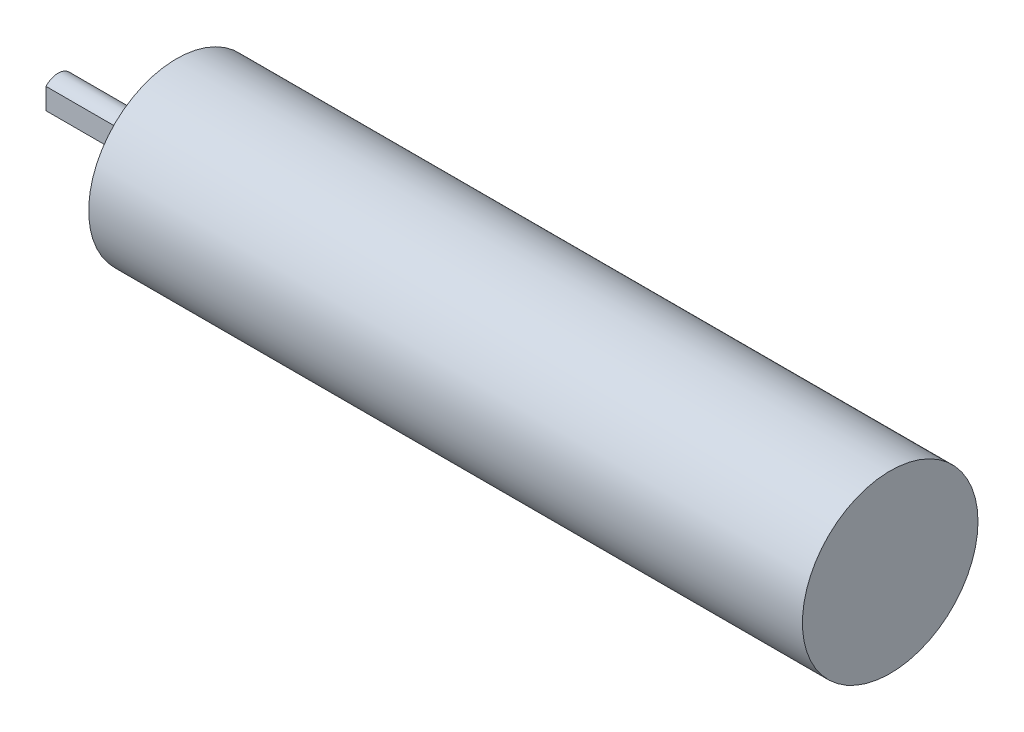
ISO-10303-21;
HEADER;
FILE_DESCRIPTION(('STEP AP214'),'2;1');
FILE_NAME('part.step','',(''),(''),'','','');
FILE_SCHEMA(('AUTOMOTIVE_DESIGN { 1 0 10303 214 1 1 1 1 }'));
ENDSEC;
DATA;
#1=APPLICATION_CONTEXT('core data for automotive mechanical design processes');
#2=APPLICATION_PROTOCOL_DEFINITION('international standard','automotive_design',2000,#1);
#3=PRODUCT_CONTEXT('',#1,'mechanical');
#4=PRODUCT('Part','Part','',(#3));
#5=PRODUCT_RELATED_PRODUCT_CATEGORY('part','',(#4));
#6=PRODUCT_DEFINITION_FORMATION('','',#4);
#7=PRODUCT_DEFINITION_CONTEXT('part definition',#1,'design');
#8=PRODUCT_DEFINITION('design','',#6,#7);
#9=PRODUCT_DEFINITION_SHAPE('','',#8);
#10=(LENGTH_UNIT() NAMED_UNIT(*) SI_UNIT(.MILLI.,.METRE.));
#11=(NAMED_UNIT(*) PLANE_ANGLE_UNIT() SI_UNIT($,.RADIAN.));
#12=(NAMED_UNIT(*) SI_UNIT($,.STERADIAN.) SOLID_ANGLE_UNIT());
#13=UNCERTAINTY_MEASURE_WITH_UNIT(LENGTH_MEASURE(1.E-05),#10,'distance_accuracy_value','');
#14=(GEOMETRIC_REPRESENTATION_CONTEXT(3) GLOBAL_UNCERTAINTY_ASSIGNED_CONTEXT((#13)) GLOBAL_UNIT_ASSIGNED_CONTEXT((#10,
#11,#12)) REPRESENTATION_CONTEXT('',''));
#15=CARTESIAN_POINT('',(0.,0.,0.));
#16=DIRECTION('',(0.,0.,1.));
#17=DIRECTION('',(1.,0.,0.));
#18=AXIS2_PLACEMENT_3D('',#15,#16,#17);
#19=CARTESIAN_POINT('',(-3.15,0.,0.));
#20=DIRECTION('',(-1.,0.,0.));
#21=DIRECTION('',(0.,0.,1.));
#22=AXIS2_PLACEMENT_3D('',#19,#20,#21);
#23=PLANE('',#22);
#24=CARTESIAN_POINT('',(-3.15,0.,0.));
#25=DIRECTION('',(-1.,0.,0.));
#26=DIRECTION('',(0.,0.,1.));
#27=AXIS2_PLACEMENT_3D('',#24,#25,#26);
#28=CIRCLE('',#27,3.5);
#29=CARTESIAN_POINT('',(-3.15,0.,3.5));
#30=VERTEX_POINT('',#29);
#31=EDGE_CURVE('E89',#30,#30,#28,.T.);
#32=ORIENTED_EDGE('',*,*,#31,.T.);
#33=EDGE_LOOP('',(#32));
#34=FACE_BOUND('',#33,.T.);
#35=CARTESIAN_POINT('',(-3.15,0.,0.));
#36=DIRECTION('',(-1.,0.,0.));
#37=DIRECTION('',(0.,0.,1.));
#38=AXIS2_PLACEMENT_3D('',#35,#36,#37);
#39=CIRCLE('',#38,2.);
#40=CARTESIAN_POINT('',(-3.15,0.,2.));
#41=VERTEX_POINT('',#40);
#42=EDGE_CURVE('E80',#41,#41,#39,.T.);
#43=ORIENTED_EDGE('',*,*,#42,.F.);
#44=EDGE_LOOP('',(#43));
#45=FACE_BOUND('',#44,.T.);
#46=ADVANCED_FACE('F38',(#34,#45),#23,.T.);
#47=CARTESIAN_POINT('',(-1.35,0.,0.));
#48=DIRECTION('',(-1.,0.,0.));
#49=DIRECTION('',(0.,0.,1.));
#50=AXIS2_PLACEMENT_3D('',#47,#48,#49);
#51=PLANE('',#50);
#52=CARTESIAN_POINT('',(-1.35,0.,0.));
#53=DIRECTION('',(-1.,0.,0.));
#54=DIRECTION('',(0.,0.,1.));
#55=AXIS2_PLACEMENT_3D('',#52,#53,#54);
#56=CIRCLE('',#55,5.);
#57=CARTESIAN_POINT('',(-1.35,0.,-5.));
#58=VERTEX_POINT('',#57);
#59=EDGE_CURVE('E47',#58,#58,#56,.T.);
#60=ORIENTED_EDGE('',*,*,#59,.T.);
#61=EDGE_LOOP('',(#60));
#62=FACE_BOUND('',#61,.T.);
#63=CARTESIAN_POINT('',(-1.35,0.,0.));
#64=DIRECTION('',(-1.,0.,0.));
#65=DIRECTION('',(0.,0.,1.));
#66=AXIS2_PLACEMENT_3D('',#63,#64,#65);
#67=CIRCLE('',#66,3.5);
#68=CARTESIAN_POINT('',(-1.35,0.,3.5));
#69=VERTEX_POINT('',#68);
#70=EDGE_CURVE('E86',#69,#69,#67,.T.);
#71=ORIENTED_EDGE('',*,*,#70,.F.);
#72=EDGE_LOOP('',(#71));
#73=FACE_BOUND('',#72,.T.);
#74=ADVANCED_FACE('F103',(#62,#73),#51,.T.);
#75=CARTESIAN_POINT('',(0.,11.,0.));
#76=DIRECTION('',(-1.,0.,0.));
#77=DIRECTION('',(0.,0.,1.));
#78=AXIS2_PLACEMENT_3D('',#75,#76,#77);
#79=PLANE('',#78);
#80=CARTESIAN_POINT('',(0.,6.06217782649,-3.5));
#81=DIRECTION('',(-1.,0.,0.));
#82=DIRECTION('',(0.,0.,1.));
#83=AXIS2_PLACEMENT_3D('',#80,#81,#82);
#84=CIRCLE('',#83,0.975000000000014);
#85=CARTESIAN_POINT('',(0.,6.06217782649,-2.52499999999999));
#86=VERTEX_POINT('',#85);
#87=EDGE_CURVE('E427',#86,#86,#84,.T.);
#88=ORIENTED_EDGE('',*,*,#87,.F.);
#89=EDGE_LOOP('',(#88));
#90=FACE_BOUND('',#89,.T.);
#91=CARTESIAN_POINT('',(0.,-6.06217782649,-3.5));
#92=DIRECTION('',(-1.,0.,0.));
#93=DIRECTION('',(0.,0.,1.));
#94=AXIS2_PLACEMENT_3D('',#91,#92,#93);
#95=CIRCLE('',#94,0.975000000000014);
#96=CARTESIAN_POINT('',(0.,-6.06217782649,-2.52499999999999));
#97=VERTEX_POINT('',#96);
#98=EDGE_CURVE('E433',#97,#97,#95,.T.);
#99=ORIENTED_EDGE('',*,*,#98,.F.);
#100=EDGE_LOOP('',(#99));
#101=FACE_BOUND('',#100,.T.);
#102=CARTESIAN_POINT('',(0.,0.,7.));
#103=DIRECTION('',(-1.,0.,0.));
#104=DIRECTION('',(0.,0.,1.));
#105=AXIS2_PLACEMENT_3D('',#102,#103,#104);
#106=CIRCLE('',#105,0.975000000000014);
#107=CARTESIAN_POINT('',(0.,0.,7.97500000000001));
#108=VERTEX_POINT('',#107);
#109=EDGE_CURVE('E439',#108,#108,#106,.T.);
#110=ORIENTED_EDGE('',*,*,#109,.F.);
#111=EDGE_LOOP('',(#110));
#112=FACE_BOUND('',#111,.T.);
#113=CARTESIAN_POINT('',(0.,0.,0.));
#114=DIRECTION('',(1.,0.,0.));
#115=DIRECTION('',(0.,0.,-1.));
#116=AXIS2_PLACEMENT_3D('',#113,#114,#115);
#117=CIRCLE('',#116,11.);
#118=CARTESIAN_POINT('',(0.,0.,-11.));
#119=VERTEX_POINT('',#118);
#120=EDGE_CURVE('E11',#119,#119,#117,.T.);
#121=ORIENTED_EDGE('',*,*,#120,.F.);
#122=EDGE_LOOP('',(#121));
#123=FACE_BOUND('',#122,.T.);
#124=CARTESIAN_POINT('',(0.,0.,0.));
#125=DIRECTION('',(-1.,0.,0.));
#126=DIRECTION('',(0.,0.,1.));
#127=AXIS2_PLACEMENT_3D('',#124,#125,#126);
#128=CIRCLE('',#127,5.);
#129=CARTESIAN_POINT('',(0.,0.,-5.));
#130=VERTEX_POINT('',#129);
#131=EDGE_CURVE('E92',#130,#130,#128,.T.);
#132=ORIENTED_EDGE('',*,*,#131,.F.);
#133=EDGE_LOOP('',(#132));
#134=FACE_BOUND('',#133,.T.);
#135=ADVANCED_FACE('F101',(#90,#101,#112,#123,#134),#79,.T.);
#136=CARTESIAN_POINT('',(0.,0.,0.));
#137=DIRECTION('',(1.,0.,0.));
#138=DIRECTION('',(0.,0.,-1.));
#139=AXIS2_PLACEMENT_3D('',#136,#137,#138);
#140=CYLINDRICAL_SURFACE('',#139,11.);
#141=ORIENTED_EDGE('',*,*,#120,.T.);
#142=EDGE_LOOP('',(#141));
#143=FACE_BOUND('',#142,.T.);
#144=CARTESIAN_POINT('',(89.43,0.,0.));
#145=DIRECTION('',(1.,0.,0.));
#146=DIRECTION('',(0.,0.,-1.));
#147=AXIS2_PLACEMENT_3D('',#144,#145,#146);
#148=CIRCLE('',#147,11.);
#149=CARTESIAN_POINT('',(89.43,0.,-11.));
#150=VERTEX_POINT('',#149);
#151=EDGE_CURVE('E402',#150,#150,#148,.T.);
#152=ORIENTED_EDGE('',*,*,#151,.F.);
#153=EDGE_LOOP('',(#152));
#154=FACE_BOUND('',#153,.T.);
#155=ADVANCED_FACE('F40',(#143,#154),#140,.T.);
#156=CARTESIAN_POINT('',(-1.35,0.,0.));
#157=DIRECTION('',(1.,0.,0.));
#158=DIRECTION('',(0.,0.,-1.));
#159=AXIS2_PLACEMENT_3D('',#156,#157,#158);
#160=CYLINDRICAL_SURFACE('',#159,5.);
#161=CARTESIAN_POINT('',(-1.35,0.,-5.));
#162=CARTESIAN_POINT('',(-1.3359375,0.,-5.));
#163=CARTESIAN_POINT('',(-1.321875,0.,-5.));
#164=CARTESIAN_POINT('',(-1.29375,0.,-5.));
#165=CARTESIAN_POINT('',(-1.2796875,0.,-5.));
#166=CARTESIAN_POINT('',(-1.2515625,0.,-5.));
#167=CARTESIAN_POINT('',(-1.2375,0.,-5.));
#168=CARTESIAN_POINT('',(-1.209375,0.,-5.));
#169=CARTESIAN_POINT('',(-1.1953125,0.,-5.));
#170=CARTESIAN_POINT('',(-1.1671875,0.,-5.));
#171=CARTESIAN_POINT('',(-1.153125,0.,-5.));
#172=CARTESIAN_POINT('',(-1.125,0.,-5.));
#173=CARTESIAN_POINT('',(-1.1109375,0.,-5.));
#174=CARTESIAN_POINT('',(-1.0828125,0.,-5.));
#175=CARTESIAN_POINT('',(-1.06875,0.,-5.));
#176=CARTESIAN_POINT('',(-1.040625,0.,-5.));
#177=CARTESIAN_POINT('',(-1.0265625,0.,-5.));
#178=CARTESIAN_POINT('',(-0.9984375,0.,-5.));
#179=CARTESIAN_POINT('',(-0.984375,0.,-5.));
#180=CARTESIAN_POINT('',(-0.95625,0.,-5.));
#181=CARTESIAN_POINT('',(-0.9421875,0.,-5.));
#182=CARTESIAN_POINT('',(-0.9140625,0.,-5.));
#183=CARTESIAN_POINT('',(-0.9,0.,-5.));
#184=CARTESIAN_POINT('',(-0.871875,0.,-5.));
#185=CARTESIAN_POINT('',(-0.8578125,0.,-5.));
#186=CARTESIAN_POINT('',(-0.8296875,0.,-5.));
#187=CARTESIAN_POINT('',(-0.815625,0.,-5.));
#188=CARTESIAN_POINT('',(-0.7875,0.,-5.));
#189=CARTESIAN_POINT('',(-0.7734375,0.,-5.));
#190=CARTESIAN_POINT('',(-0.7453125,0.,-5.));
#191=CARTESIAN_POINT('',(-0.73125,0.,-5.));
#192=CARTESIAN_POINT('',(-0.703125,0.,-5.));
#193=CARTESIAN_POINT('',(-0.6890625,0.,-5.));
#194=CARTESIAN_POINT('',(-0.6609375,0.,-5.));
#195=CARTESIAN_POINT('',(-0.646875,0.,-5.));
#196=CARTESIAN_POINT('',(-0.61875,0.,-5.));
#197=CARTESIAN_POINT('',(-0.6046875,0.,-5.));
#198=CARTESIAN_POINT('',(-0.5765625,0.,-5.));
#199=CARTESIAN_POINT('',(-0.5625,0.,-5.));
#200=CARTESIAN_POINT('',(-0.534375,0.,-5.));
#201=CARTESIAN_POINT('',(-0.5203125,0.,-5.));
#202=CARTESIAN_POINT('',(-0.4921875,0.,-5.));
#203=CARTESIAN_POINT('',(-0.478125,0.,-5.));
#204=CARTESIAN_POINT('',(-0.45,0.,-5.));
#205=CARTESIAN_POINT('',(-0.4359375,0.,-5.));
#206=CARTESIAN_POINT('',(-0.4078125,0.,-5.));
#207=CARTESIAN_POINT('',(-0.39375,0.,-5.));
#208=CARTESIAN_POINT('',(-0.365625,0.,-5.));
#209=CARTESIAN_POINT('',(-0.3515625,0.,-5.));
#210=CARTESIAN_POINT('',(-0.3234375,0.,-5.));
#211=CARTESIAN_POINT('',(-0.309375,0.,-5.));
#212=CARTESIAN_POINT('',(-0.28125,0.,-5.));
#213=CARTESIAN_POINT('',(-0.2671875,0.,-5.));
#214=CARTESIAN_POINT('',(-0.2390625,0.,-5.));
#215=CARTESIAN_POINT('',(-0.225,0.,-5.));
#216=CARTESIAN_POINT('',(-0.196875,0.,-5.));
#217=CARTESIAN_POINT('',(-0.1828125,0.,-5.));
#218=CARTESIAN_POINT('',(-0.1546875,0.,-5.));
#219=CARTESIAN_POINT('',(-0.140625,0.,-5.));
#220=CARTESIAN_POINT('',(-0.1125,0.,-5.));
#221=CARTESIAN_POINT('',(-0.0984374999999998,0.,-5.));
#222=CARTESIAN_POINT('',(-0.0703124999999998,0.,-5.));
#223=CARTESIAN_POINT('',(-0.0562499999999997,0.,-5.));
#224=CARTESIAN_POINT('',(-0.0281249999999997,0.,-5.));
#225=CARTESIAN_POINT('',(-0.0140624999999997,0.,-5.));
#226=CARTESIAN_POINT('',(0.,0.,-5.));
#227=B_SPLINE_CURVE_WITH_KNOTS('',3,(#161,#162,#163,#164,#165,#166,#167,#168,#169,#170,#171,
#172,#173,#174,#175,#176,#177,#178,#179,#180,#181,#182,#183,#184,#185,#186,#187,#188,#189,#190,
#191,#192,#193,#194,#195,#196,#197,#198,#199,#200,#201,#202,#203,#204,#205,#206,#207,#208,#209,
#210,#211,#212,#213,#214,#215,#216,#217,#218,#219,#220,#221,#222,#223,#224,#225,#226),
.UNSPECIFIED.,.F.,.F.,(4,2,2,2,2,2,2,2,2,2,2,2,2,2,2,2,2,2,2,2,2,2,2,2,2,2,2,2,2,2,2,2,4),(0.,
0.0421875000000001,0.084375,0.1265625,0.16875,0.2109375,0.253125,0.2953125,0.3375,0.3796875,
0.421875,0.4640625,0.50625,0.5484375,0.590625,0.6328125,0.675,0.7171875,0.759375,0.8015625,
0.84375,0.8859375,0.928125,0.9703125,1.0125,1.0546875,1.096875,1.1390625,1.18125,1.2234375,
1.265625,1.3078125,1.35),.UNSPECIFIED.);
#228=EDGE_CURVE('BSEAM99',#58,#130,#227,.T.);
#229=ORIENTED_EDGE('',*,*,#59,.F.);
#230=ORIENTED_EDGE('',*,*,#131,.T.);
#231=ORIENTED_EDGE('',*,*,#228,.T.);
#232=ORIENTED_EDGE('',*,*,#228,.F.);
#233=EDGE_LOOP('',(#229,#231,#230,#232));
#234=FACE_BOUND('',#233,.T.);
#235=ADVANCED_FACE('F99',(#234),#160,.T.);
#236=CARTESIAN_POINT('',(-3.15,0.,0.));
#237=DIRECTION('',(1.,0.,0.));
#238=DIRECTION('',(0.,0.,-1.));
#239=AXIS2_PLACEMENT_3D('',#236,#237,#238);
#240=CYLINDRICAL_SURFACE('',#239,3.5);
#241=ORIENTED_EDGE('',*,*,#31,.F.);
#242=EDGE_LOOP('',(#241));
#243=FACE_BOUND('',#242,.T.);
#244=ORIENTED_EDGE('',*,*,#70,.T.);
#245=EDGE_LOOP('',(#244));
#246=FACE_BOUND('',#245,.T.);
#247=ADVANCED_FACE('F124',(#243,#246),#240,.T.);
#248=CARTESIAN_POINT('',(-14.85,0.,0.));
#249=DIRECTION('',(1.,0.,0.));
#250=DIRECTION('',(0.,0.,-1.));
#251=AXIS2_PLACEMENT_3D('',#248,#249,#250);
#252=CYLINDRICAL_SURFACE('',#251,2.);
#253=CARTESIAN_POINT('',(-14.85,0.,0.));
#254=DIRECTION('',(-1.,0.,0.));
#255=DIRECTION('',(0.,0.,1.));
#256=AXIS2_PLACEMENT_3D('',#253,#254,#255);
#257=CIRCLE('',#256,2.);
#258=CARTESIAN_POINT('',(-14.85,1.32287565553165,1.50000000000057));
#259=VERTEX_POINT('',#258);
#260=CARTESIAN_POINT('',(-14.85,-1.32287565553165,1.50000000000057));
#261=VERTEX_POINT('',#260);
#262=EDGE_CURVE('E84',#259,#261,#257,.T.);
#263=ORIENTED_EDGE('',*,*,#262,.F.);
#264=DIRECTION('',(-1.,0.,0.));
#265=VECTOR('',#264,1.);
#266=CARTESIAN_POINT('',(-2.34976552175177,1.32287565553165,1.50000000000057));
#267=LINE('',#266,#265);
#268=CARTESIAN_POINT('',(-5.84999999999943,1.32287565553165,1.50000000000057));
#269=VERTEX_POINT('',#268);
#270=EDGE_CURVE('E54',#269,#259,#267,.T.);
#271=ORIENTED_EDGE('',*,*,#270,.F.);
#272=CARTESIAN_POINT('',(-7.35,0.,0.));
#273=DIRECTION('',(0.707106781186547,0.,-0.707106781186548));
#274=DIRECTION('',(-0.707106781186548,0.,-0.707106781186547));
#275=AXIS2_PLACEMENT_3D('',#272,#273,#274);
#276=ELLIPSE('',#275,2.82842712474619,2.);
#277=CARTESIAN_POINT('',(-5.84999999999943,-1.32287565553165,1.50000000000057));
#278=VERTEX_POINT('',#277);
#279=EDGE_CURVE('E72',#278,#269,#276,.F.);
#280=ORIENTED_EDGE('',*,*,#279,.F.);
#281=DIRECTION('',(-1.,0.,0.));
#282=VECTOR('',#281,1.);
#283=CARTESIAN_POINT('',(-2.34976552175177,-1.32287565553165,1.50000000000057));
#284=LINE('',#283,#282);
#285=EDGE_CURVE('E63',#278,#261,#284,.T.);
#286=ORIENTED_EDGE('',*,*,#285,.T.);
#287=EDGE_LOOP('',(#263,#271,#280,#286));
#288=FACE_BOUND('',#287,.T.);
#289=ORIENTED_EDGE('',*,*,#42,.T.);
#290=EDGE_LOOP('',(#289));
#291=FACE_BOUND('',#290,.T.);
#292=ADVANCED_FACE('F77',(#288,#291),#252,.T.);
#293=CARTESIAN_POINT('',(-14.85,0.,0.));
#294=DIRECTION('',(-1.,0.,0.));
#295=DIRECTION('',(0.,0.,1.));
#296=AXIS2_PLACEMENT_3D('',#293,#294,#295);
#297=PLANE('',#296);
#298=DIRECTION('',(0.,-1.,0.));
#299=VECTOR('',#298,1.);
#300=CARTESIAN_POINT('',(-14.85,1.32287565553165,1.50000000000057));
#301=LINE('',#300,#299);
#302=EDGE_CURVE('E59',#259,#261,#301,.T.);
#303=ORIENTED_EDGE('',*,*,#302,.F.);
#304=ORIENTED_EDGE('',*,*,#262,.T.);
#305=EDGE_LOOP('',(#303,#304));
#306=FACE_BOUND('',#305,.T.);
#307=ADVANCED_FACE('F148',(#306),#297,.T.);
#308=CARTESIAN_POINT('',(-3.675,0.,3.675));
#309=DIRECTION('',(0.707106781186547,0.,-0.707106781186548));
#310=DIRECTION('',(-0.707106781186548,0.,-0.707106781186547));
#311=AXIS2_PLACEMENT_3D('',#308,#309,#310);
#312=PLANE('',#311);
#313=ORIENTED_EDGE('',*,*,#279,.T.);
#314=DIRECTION('',(0.,-1.,0.));
#315=VECTOR('',#314,1.);
#316=CARTESIAN_POINT('',(-5.84999999999943,1.32287565553165,1.50000000000057));
#317=LINE('',#316,#315);
#318=EDGE_CURVE('E66',#269,#278,#317,.T.);
#319=ORIENTED_EDGE('',*,*,#318,.T.);
#320=EDGE_LOOP('',(#313,#319));
#321=FACE_BOUND('',#320,.T.);
#322=ADVANCED_FACE('F75',(#321),#312,.F.);
#323=CARTESIAN_POINT('',(-2.34976552175177,1.32287565553165,1.50000000000057));
#324=DIRECTION('',(0.,0.,-1.));
#325=DIRECTION('',(0.,1.,0.));
#326=AXIS2_PLACEMENT_3D('',#323,#324,#325);
#327=PLANE('',#326);
#328=ORIENTED_EDGE('',*,*,#270,.T.);
#329=ORIENTED_EDGE('',*,*,#302,.T.);
#330=ORIENTED_EDGE('',*,*,#285,.F.);
#331=ORIENTED_EDGE('',*,*,#318,.F.);
#332=EDGE_LOOP('',(#328,#329,#330,#331));
#333=FACE_BOUND('',#332,.T.);
#334=ADVANCED_FACE('F65',(#333),#327,.F.);
#335=CARTESIAN_POINT('',(6.50000000000001,0.,7.));
#336=DIRECTION('',(1.,0.,0.));
#337=DIRECTION('',(0.,0.,-1.));
#338=AXIS2_PLACEMENT_3D('',#335,#336,#337);
#339=PLANE('',#338);
#340=CARTESIAN_POINT('',(6.50000000000001,0.,7.));
#341=DIRECTION('',(-1.,0.,0.));
#342=DIRECTION('',(0.,0.,1.));
#343=AXIS2_PLACEMENT_3D('',#340,#341,#342);
#344=CIRCLE('',#343,0.975000000000014);
#345=CARTESIAN_POINT('',(6.50000000000001,0.,7.97500000000001));
#346=VERTEX_POINT('',#345);
#347=EDGE_CURVE('E442',#346,#346,#344,.T.);
#348=ORIENTED_EDGE('',*,*,#347,.T.);
#349=EDGE_LOOP('',(#348));
#350=FACE_BOUND('',#349,.T.);
#351=ADVANCED_FACE('F166',(#350),#339,.F.);
#352=CARTESIAN_POINT('',(0.,0.,7.));
#353=DIRECTION('',(-1.,0.,0.));
#354=DIRECTION('',(0.,0.,1.));
#355=AXIS2_PLACEMENT_3D('',#352,#353,#354);
#356=CYLINDRICAL_SURFACE('',#355,0.975000000000014);
#357=ORIENTED_EDGE('',*,*,#347,.F.);
#358=EDGE_LOOP('',(#357));
#359=FACE_BOUND('',#358,.T.);
#360=ORIENTED_EDGE('',*,*,#109,.T.);
#361=EDGE_LOOP('',(#360));
#362=FACE_BOUND('',#361,.T.);
#363=ADVANCED_FACE('F173',(#359,#362),#356,.F.);
#364=CARTESIAN_POINT('',(6.50000000000001,-6.06217782649,-3.5));
#365=DIRECTION('',(1.,0.,0.));
#366=DIRECTION('',(0.,0.,-1.));
#367=AXIS2_PLACEMENT_3D('',#364,#365,#366);
#368=PLANE('',#367);
#369=CARTESIAN_POINT('',(6.50000000000001,-6.06217782649,-3.5));
#370=DIRECTION('',(-1.,0.,0.));
#371=DIRECTION('',(0.,0.,1.));
#372=AXIS2_PLACEMENT_3D('',#369,#370,#371);
#373=CIRCLE('',#372,0.975000000000014);
#374=CARTESIAN_POINT('',(6.50000000000001,-6.06217782649,-2.52499999999999));
#375=VERTEX_POINT('',#374);
#376=EDGE_CURVE('E436',#375,#375,#373,.T.);
#377=ORIENTED_EDGE('',*,*,#376,.T.);
#378=EDGE_LOOP('',(#377));
#379=FACE_BOUND('',#378,.T.);
#380=ADVANCED_FACE('F181',(#379),#368,.F.);
#381=CARTESIAN_POINT('',(0.,-6.06217782649,-3.5));
#382=DIRECTION('',(-1.,0.,0.));
#383=DIRECTION('',(0.,0.,1.));
#384=AXIS2_PLACEMENT_3D('',#381,#382,#383);
#385=CYLINDRICAL_SURFACE('',#384,0.975000000000014);
#386=ORIENTED_EDGE('',*,*,#376,.F.);
#387=EDGE_LOOP('',(#386));
#388=FACE_BOUND('',#387,.T.);
#389=ORIENTED_EDGE('',*,*,#98,.T.);
#390=EDGE_LOOP('',(#389));
#391=FACE_BOUND('',#390,.T.);
#392=ADVANCED_FACE('F189',(#388,#391),#385,.F.);
#393=CARTESIAN_POINT('',(6.50000000000001,6.06217782649,-3.5));
#394=DIRECTION('',(1.,0.,0.));
#395=DIRECTION('',(0.,0.,-1.));
#396=AXIS2_PLACEMENT_3D('',#393,#394,#395);
#397=PLANE('',#396);
#398=CARTESIAN_POINT('',(6.50000000000001,6.06217782649,-3.5));
#399=DIRECTION('',(-1.,0.,0.));
#400=DIRECTION('',(0.,0.,1.));
#401=AXIS2_PLACEMENT_3D('',#398,#399,#400);
#402=CIRCLE('',#401,0.975000000000014);
#403=CARTESIAN_POINT('',(6.50000000000001,6.06217782649,-2.52499999999999));
#404=VERTEX_POINT('',#403);
#405=EDGE_CURVE('E430',#404,#404,#402,.T.);
#406=ORIENTED_EDGE('',*,*,#405,.T.);
#407=EDGE_LOOP('',(#406));
#408=FACE_BOUND('',#407,.T.);
#409=ADVANCED_FACE('F197',(#408),#397,.F.);
#410=CARTESIAN_POINT('',(0.,6.06217782649,-3.5));
#411=DIRECTION('',(-1.,0.,0.));
#412=DIRECTION('',(0.,0.,1.));
#413=AXIS2_PLACEMENT_3D('',#410,#411,#412);
#414=CYLINDRICAL_SURFACE('',#413,0.975000000000014);
#415=ORIENTED_EDGE('',*,*,#405,.F.);
#416=EDGE_LOOP('',(#415));
#417=FACE_BOUND('',#416,.T.);
#418=ORIENTED_EDGE('',*,*,#87,.T.);
#419=EDGE_LOOP('',(#418));
#420=FACE_BOUND('',#419,.T.);
#421=ADVANCED_FACE('F205',(#417,#420),#414,.F.);
#422=CARTESIAN_POINT('',(89.43,0.,0.));
#423=DIRECTION('',(1.,0.,0.));
#424=DIRECTION('',(0.,0.,-1.));
#425=AXIS2_PLACEMENT_3D('',#422,#423,#424);
#426=PLANE('',#425);
#427=ORIENTED_EDGE('',*,*,#151,.T.);
#428=EDGE_LOOP('',(#427));
#429=FACE_BOUND('',#428,.T.);
#430=ADVANCED_FACE('F213',(#429),#426,.T.);
#431=CLOSED_SHELL('',(#46,#74,#135,#155,#235,#247,#292,#307,#322,#334,#351,#363,#380,#392,#409,
#421,#430));
#432=CARTESIAN_POINT('',(46.2,0.,0.));
#433=DIRECTION('',(-1.,0.,0.));
#434=DIRECTION('',(0.,0.,1.));
#435=AXIS2_PLACEMENT_3D('',#432,#433,#434);
#436=PLANE('',#435);
#437=CARTESIAN_POINT('',(46.2,0.,0.));
#438=DIRECTION('',(1.,0.,0.));
#439=DIRECTION('',(0.,0.,-1.));
#440=AXIS2_PLACEMENT_3D('',#437,#438,#439);
#441=CIRCLE('',#440,3.50000000000001);
#442=CARTESIAN_POINT('',(46.2,0.,-3.50000000000001));
#443=VERTEX_POINT('',#442);
#444=EDGE_CURVE('E424',#443,#443,#441,.T.);
#445=ORIENTED_EDGE('',*,*,#444,.T.);
#446=EDGE_LOOP('',(#445));
#447=FACE_BOUND('',#446,.T.);
#448=ADVANCED_FACE('F227',(#447),#436,.F.);
#449=CARTESIAN_POINT('',(52.6,0.,0.));
#450=DIRECTION('',(1.,0.,0.));
#451=DIRECTION('',(0.,0.,-1.));
#452=AXIS2_PLACEMENT_3D('',#449,#450,#451);
#453=CYLINDRICAL_SURFACE('',#452,3.50000000000001);
#454=ORIENTED_EDGE('',*,*,#444,.F.);
#455=EDGE_LOOP('',(#454));
#456=FACE_BOUND('',#455,.T.);
#457=CARTESIAN_POINT('',(52.6,0.,0.));
#458=DIRECTION('',(1.,0.,0.));
#459=DIRECTION('',(0.,0.,-1.));
#460=AXIS2_PLACEMENT_3D('',#457,#458,#459);
#461=CIRCLE('',#460,3.50000000000001);
#462=CARTESIAN_POINT('',(52.6,0.,-3.50000000000001));
#463=VERTEX_POINT('',#462);
#464=EDGE_CURVE('E412',#463,#463,#461,.F.);
#465=ORIENTED_EDGE('',*,*,#464,.F.);
#466=EDGE_LOOP('',(#465));
#467=FACE_BOUND('',#466,.T.);
#468=ADVANCED_FACE('F230',(#456,#467),#453,.F.);
#469=CARTESIAN_POINT('',(52.6,0.,0.));
#470=DIRECTION('',(1.,0.,0.));
#471=DIRECTION('',(0.,0.,-1.));
#472=AXIS2_PLACEMENT_3D('',#469,#470,#471);
#473=PLANE('',#472);
#474=ORIENTED_EDGE('',*,*,#464,.T.);
#475=EDGE_LOOP('',(#474));
#476=FACE_BOUND('',#475,.T.);
#477=ADVANCED_FACE('F239',(#476),#473,.F.);
#478=CLOSED_SHELL('',(#448,#468,#477));
#479=CARTESIAN_POINT('',(49.6,0.,8.5));
#480=DIRECTION('',(-1.,0.,0.));
#481=DIRECTION('',(0.,0.,1.));
#482=AXIS2_PLACEMENT_3D('',#479,#480,#481);
#483=PLANE('',#482);
#484=CARTESIAN_POINT('',(49.6,0.,8.5));
#485=DIRECTION('',(1.,0.,0.));
#486=DIRECTION('',(0.,0.,-1.));
#487=AXIS2_PLACEMENT_3D('',#484,#485,#486);
#488=CIRCLE('',#487,1.05000000000001);
#489=CARTESIAN_POINT('',(49.6,0.,7.44999999999999));
#490=VERTEX_POINT('',#489);
#491=EDGE_CURVE('E421',#490,#490,#488,.T.);
#492=ORIENTED_EDGE('',*,*,#491,.T.);
#493=EDGE_LOOP('',(#492));
#494=FACE_BOUND('',#493,.T.);
#495=ADVANCED_FACE('F254',(#494),#483,.F.);
#496=CARTESIAN_POINT('',(52.6,0.,8.5));
#497=DIRECTION('',(1.,0.,0.));
#498=DIRECTION('',(0.,0.,-1.));
#499=AXIS2_PLACEMENT_3D('',#496,#497,#498);
#500=CYLINDRICAL_SURFACE('',#499,1.05000000000001);
#501=ORIENTED_EDGE('',*,*,#491,.F.);
#502=EDGE_LOOP('',(#501));
#503=FACE_BOUND('',#502,.T.);
#504=CARTESIAN_POINT('',(52.6,0.,8.5));
#505=DIRECTION('',(1.,0.,0.));
#506=DIRECTION('',(0.,0.,-1.));
#507=AXIS2_PLACEMENT_3D('',#504,#505,#506);
#508=CIRCLE('',#507,1.05000000000001);
#509=CARTESIAN_POINT('',(52.6,0.,7.44999999999999));
#510=VERTEX_POINT('',#509);
#511=EDGE_CURVE('E405',#510,#510,#508,.F.);
#512=ORIENTED_EDGE('',*,*,#511,.F.);
#513=EDGE_LOOP('',(#512));
#514=FACE_BOUND('',#513,.T.);
#515=ADVANCED_FACE('F257',(#503,#514),#500,.F.);
#516=ORIENTED_EDGE('',*,*,#511,.T.);
#517=EDGE_LOOP('',(#516));
#518=FACE_BOUND('',#517,.T.);
#519=ADVANCED_FACE('F249',(#518),#473,.F.);
#520=CLOSED_SHELL('',(#495,#515,#519));
#521=CARTESIAN_POINT('',(49.6,-7.36121593217,-4.25));
#522=DIRECTION('',(-1.,0.,0.));
#523=DIRECTION('',(0.,0.,1.));
#524=AXIS2_PLACEMENT_3D('',#521,#522,#523);
#525=PLANE('',#524);
#526=CARTESIAN_POINT('',(49.6,-7.36121593217,-4.25));
#527=DIRECTION('',(1.,0.,0.));
#528=DIRECTION('',(0.,0.,-1.));
#529=AXIS2_PLACEMENT_3D('',#526,#527,#528);
#530=CIRCLE('',#529,1.05000000000001);
#531=CARTESIAN_POINT('',(49.6,-7.36121593217,-5.30000000000001));
#532=VERTEX_POINT('',#531);
#533=EDGE_CURVE('E418',#532,#532,#530,.T.);
#534=ORIENTED_EDGE('',*,*,#533,.T.);
#535=EDGE_LOOP('',(#534));
#536=FACE_BOUND('',#535,.T.);
#537=ADVANCED_FACE('F279',(#536),#525,.F.);
#538=CARTESIAN_POINT('',(52.6,-7.36121593217,-4.25));
#539=DIRECTION('',(1.,0.,0.));
#540=DIRECTION('',(0.,0.,-1.));
#541=AXIS2_PLACEMENT_3D('',#538,#539,#540);
#542=CYLINDRICAL_SURFACE('',#541,1.05000000000001);
#543=ORIENTED_EDGE('',*,*,#533,.F.);
#544=EDGE_LOOP('',(#543));
#545=FACE_BOUND('',#544,.T.);
#546=CARTESIAN_POINT('',(52.6,-7.36121593217,-4.25));
#547=DIRECTION('',(1.,0.,0.));
#548=DIRECTION('',(0.,0.,-1.));
#549=AXIS2_PLACEMENT_3D('',#546,#547,#548);
#550=CIRCLE('',#549,1.05000000000001);
#551=CARTESIAN_POINT('',(52.6,-7.36121593217,-5.30000000000001));
#552=VERTEX_POINT('',#551);
#553=EDGE_CURVE('E401',#552,#552,#550,.F.);
#554=ORIENTED_EDGE('',*,*,#553,.F.);
#555=EDGE_LOOP('',(#554));
#556=FACE_BOUND('',#555,.T.);
#557=ADVANCED_FACE('F282',(#545,#556),#542,.F.);
#558=ORIENTED_EDGE('',*,*,#553,.T.);
#559=EDGE_LOOP('',(#558));
#560=FACE_BOUND('',#559,.T.);
#561=ADVANCED_FACE('F275',(#560),#473,.F.);
#562=CLOSED_SHELL('',(#537,#557,#561));
#563=CARTESIAN_POINT('',(49.6,7.36121593217,-4.25));
#564=DIRECTION('',(-1.,0.,0.));
#565=DIRECTION('',(0.,0.,1.));
#566=AXIS2_PLACEMENT_3D('',#563,#564,#565);
#567=PLANE('',#566);
#568=CARTESIAN_POINT('',(49.6,7.36121593217,-4.25));
#569=DIRECTION('',(1.,0.,0.));
#570=DIRECTION('',(0.,0.,-1.));
#571=AXIS2_PLACEMENT_3D('',#568,#569,#570);
#572=CIRCLE('',#571,1.05000000000001);
#573=CARTESIAN_POINT('',(49.6,7.36121593217,-5.30000000000001));
#574=VERTEX_POINT('',#573);
#575=EDGE_CURVE('E415',#574,#574,#572,.T.);
#576=ORIENTED_EDGE('',*,*,#575,.T.);
#577=EDGE_LOOP('',(#576));
#578=FACE_BOUND('',#577,.T.);
#579=ADVANCED_FACE('F303',(#578),#567,.F.);
#580=CARTESIAN_POINT('',(52.6,7.36121593217,-4.25));
#581=DIRECTION('',(1.,0.,0.));
#582=DIRECTION('',(0.,0.,-1.));
#583=AXIS2_PLACEMENT_3D('',#580,#581,#582);
#584=CYLINDRICAL_SURFACE('',#583,1.05000000000001);
#585=ORIENTED_EDGE('',*,*,#575,.F.);
#586=EDGE_LOOP('',(#585));
#587=FACE_BOUND('',#586,.T.);
#588=CARTESIAN_POINT('',(52.6,7.36121593217,-4.25));
#589=DIRECTION('',(1.,0.,0.));
#590=DIRECTION('',(0.,0.,-1.));
#591=AXIS2_PLACEMENT_3D('',#588,#589,#590);
#592=CIRCLE('',#591,1.05000000000001);
#593=CARTESIAN_POINT('',(52.6,7.36121593217,-5.30000000000001));
#594=VERTEX_POINT('',#593);
#595=EDGE_CURVE('E399',#594,#594,#592,.F.);
#596=ORIENTED_EDGE('',*,*,#595,.F.);
#597=EDGE_LOOP('',(#596));
#598=FACE_BOUND('',#597,.T.);
#599=ADVANCED_FACE('F306',(#587,#598),#584,.F.);
#600=ORIENTED_EDGE('',*,*,#595,.T.);
#601=EDGE_LOOP('',(#600));
#602=FACE_BOUND('',#601,.T.);
#603=ADVANCED_FACE('F250',(#602),#473,.F.);
#604=CLOSED_SHELL('',(#579,#599,#603));
#605=ORIENTED_CLOSED_SHELL('',*,#478,.T.);
#606=ORIENTED_CLOSED_SHELL('',*,#520,.T.);
#607=ORIENTED_CLOSED_SHELL('',*,#562,.T.);
#608=ORIENTED_CLOSED_SHELL('',*,#604,.T.);
#609=BREP_WITH_VOIDS('B2',#431,(#605,#606,#607,#608));
#610=ADVANCED_BREP_SHAPE_REPRESENTATION('',(#18,#609),#14);
#611=SHAPE_DEFINITION_REPRESENTATION(#9,#610);
ENDSEC;
END-ISO-10303-21;
